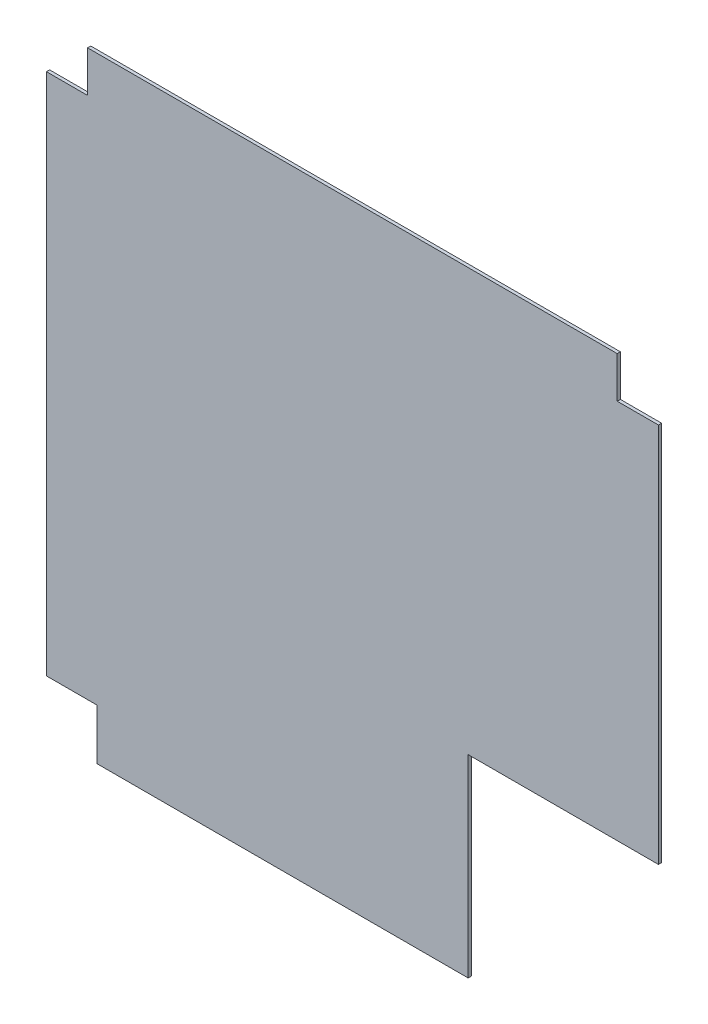
ISO-10303-21;
HEADER;
FILE_DESCRIPTION(('STEP AP214'),'2;1');
FILE_NAME('part.step','',(''),(''),'','','');
FILE_SCHEMA(('AUTOMOTIVE_DESIGN { 1 0 10303 214 1 1 1 1 }'));
ENDSEC;
DATA;
#1=APPLICATION_CONTEXT('core data for automotive mechanical design processes');
#2=APPLICATION_PROTOCOL_DEFINITION('international standard','automotive_design',2000,#1);
#3=PRODUCT_CONTEXT('',#1,'mechanical');
#4=PRODUCT('Part','Part','',(#3));
#5=PRODUCT_RELATED_PRODUCT_CATEGORY('part','',(#4));
#6=PRODUCT_DEFINITION_FORMATION('','',#4);
#7=PRODUCT_DEFINITION_CONTEXT('part definition',#1,'design');
#8=PRODUCT_DEFINITION('design','',#6,#7);
#9=PRODUCT_DEFINITION_SHAPE('','',#8);
#10=(LENGTH_UNIT() NAMED_UNIT(*) SI_UNIT(.MILLI.,.METRE.));
#11=(NAMED_UNIT(*) PLANE_ANGLE_UNIT() SI_UNIT($,.RADIAN.));
#12=(NAMED_UNIT(*) SI_UNIT($,.STERADIAN.) SOLID_ANGLE_UNIT());
#13=UNCERTAINTY_MEASURE_WITH_UNIT(LENGTH_MEASURE(1.E-05),#10,'distance_accuracy_value','');
#14=(GEOMETRIC_REPRESENTATION_CONTEXT(3) GLOBAL_UNCERTAINTY_ASSIGNED_CONTEXT((#13)) GLOBAL_UNIT_ASSIGNED_CONTEXT((#10,
#11,#12)) REPRESENTATION_CONTEXT('',''));
#15=CARTESIAN_POINT('',(0.,0.,0.));
#16=DIRECTION('',(0.,0.,1.));
#17=DIRECTION('',(1.,0.,0.));
#18=AXIS2_PLACEMENT_3D('',#15,#16,#17);
#19=CARTESIAN_POINT('',(-371.475,307.975,3.175));
#20=DIRECTION('',(0.,-1.,0.));
#21=DIRECTION('',(0.,0.,-1.));
#22=AXIS2_PLACEMENT_3D('',#19,#20,#21);
#23=PLANE('',#22);
#24=DIRECTION('',(-1.,0.,0.));
#25=VECTOR('',#24,1.);
#26=CARTESIAN_POINT('',(-371.475,307.975,3.175));
#27=LINE('',#26,#25);
#28=CARTESIAN_POINT('',(200.025,307.975,3.175));
#29=VERTEX_POINT('',#28);
#30=CARTESIAN_POINT('',(-330.2,307.975,3.175));
#31=VERTEX_POINT('',#30);
#32=EDGE_CURVE('E182',#29,#31,#27,.T.);
#33=ORIENTED_EDGE('',*,*,#32,.F.);
#34=DIRECTION('',(0.,0.,1.));
#35=VECTOR('',#34,1.);
#36=CARTESIAN_POINT('',(200.025,307.975,0.));
#37=LINE('',#36,#35);
#38=CARTESIAN_POINT('',(200.025,307.975,0.));
#39=VERTEX_POINT('',#38);
#40=EDGE_CURVE('E137',#39,#29,#37,.T.);
#41=ORIENTED_EDGE('',*,*,#40,.F.);
#42=DIRECTION('',(-1.,0.,0.));
#43=VECTOR('',#42,1.);
#44=CARTESIAN_POINT('',(-371.475,307.975,0.));
#45=LINE('',#44,#43);
#46=CARTESIAN_POINT('',(-330.2,307.975,0.));
#47=VERTEX_POINT('',#46);
#48=EDGE_CURVE('E178',#39,#47,#45,.T.);
#49=ORIENTED_EDGE('',*,*,#48,.T.);
#50=DIRECTION('',(0.,0.,1.));
#51=VECTOR('',#50,1.);
#52=CARTESIAN_POINT('',(-330.2,307.975,0.));
#53=LINE('',#52,#51);
#54=EDGE_CURVE('E175',#47,#31,#53,.T.);
#55=ORIENTED_EDGE('',*,*,#54,.T.);
#56=EDGE_LOOP('',(#33,#41,#49,#55));
#57=FACE_BOUND('',#56,.T.);
#58=ADVANCED_FACE('F40',(#57),#23,.F.);
#59=CARTESIAN_POINT('',(-371.475,-307.975,3.175));
#60=DIRECTION('',(0.,1.,0.));
#61=DIRECTION('',(0.,0.,1.));
#62=AXIS2_PLACEMENT_3D('',#59,#60,#61);
#63=PLANE('',#62);
#64=DIRECTION('',(1.,0.,0.));
#65=VECTOR('',#64,1.);
#66=CARTESIAN_POINT('',(-371.475,-307.975,3.175));
#67=LINE('',#66,#65);
#68=CARTESIAN_POINT('',(-320.675,-307.975,3.175));
#69=VERTEX_POINT('',#68);
#70=CARTESIAN_POINT('',(50.8000000000001,-307.975,3.175));
#71=VERTEX_POINT('',#70);
#72=EDGE_CURVE('E11',#69,#71,#67,.T.);
#73=ORIENTED_EDGE('',*,*,#72,.F.);
#74=DIRECTION('',(0.,0.,1.));
#75=VECTOR('',#74,1.);
#76=CARTESIAN_POINT('',(-320.675,-307.975,0.));
#77=LINE('',#76,#75);
#78=CARTESIAN_POINT('',(-320.675,-307.975,0.));
#79=VERTEX_POINT('',#78);
#80=EDGE_CURVE('E202',#79,#69,#77,.T.);
#81=ORIENTED_EDGE('',*,*,#80,.F.);
#82=DIRECTION('',(1.,0.,0.));
#83=VECTOR('',#82,1.);
#84=CARTESIAN_POINT('',(-371.475,-307.975,0.));
#85=LINE('',#84,#83);
#86=CARTESIAN_POINT('',(50.8000000000001,-307.975,0.));
#87=VERTEX_POINT('',#86);
#88=EDGE_CURVE('E43',#79,#87,#85,.T.);
#89=ORIENTED_EDGE('',*,*,#88,.T.);
#90=DIRECTION('',(0.,0.,1.));
#91=VECTOR('',#90,1.);
#92=CARTESIAN_POINT('',(50.8000000000001,-307.975,0.));
#93=LINE('',#92,#91);
#94=EDGE_CURVE('E201',#87,#71,#93,.T.);
#95=ORIENTED_EDGE('',*,*,#94,.T.);
#96=EDGE_LOOP('',(#73,#81,#89,#95));
#97=FACE_BOUND('',#96,.T.);
#98=ADVANCED_FACE('F200',(#97),#63,.F.);
#99=CARTESIAN_POINT('',(-371.475,-307.975,3.175));
#100=DIRECTION('',(1.,0.,0.));
#101=DIRECTION('',(0.,0.,-1.));
#102=AXIS2_PLACEMENT_3D('',#99,#100,#101);
#103=PLANE('',#102);
#104=DIRECTION('',(0.,-1.,0.));
#105=VECTOR('',#104,1.);
#106=CARTESIAN_POINT('',(-371.475,-307.975,0.));
#107=LINE('',#106,#105);
#108=CARTESIAN_POINT('',(-371.475,266.7,0.));
#109=VERTEX_POINT('',#108);
#110=CARTESIAN_POINT('',(-371.475,-257.175,0.));
#111=VERTEX_POINT('',#110);
#112=EDGE_CURVE('E188',#109,#111,#107,.T.);
#113=ORIENTED_EDGE('',*,*,#112,.T.);
#114=DIRECTION('',(0.,0.,1.));
#115=VECTOR('',#114,1.);
#116=CARTESIAN_POINT('',(-371.475,-257.175,0.));
#117=LINE('',#116,#115);
#118=CARTESIAN_POINT('',(-371.475,-257.175,3.175));
#119=VERTEX_POINT('',#118);
#120=EDGE_CURVE('E154',#111,#119,#117,.T.);
#121=ORIENTED_EDGE('',*,*,#120,.T.);
#122=DIRECTION('',(0.,-1.,0.));
#123=VECTOR('',#122,1.);
#124=CARTESIAN_POINT('',(-371.475,-307.975,3.175));
#125=LINE('',#124,#123);
#126=CARTESIAN_POINT('',(-371.475,266.7,3.175));
#127=VERTEX_POINT('',#126);
#128=EDGE_CURVE('E48',#127,#119,#125,.T.);
#129=ORIENTED_EDGE('',*,*,#128,.F.);
#130=DIRECTION('',(0.,0.,1.));
#131=VECTOR('',#130,1.);
#132=CARTESIAN_POINT('',(-371.475,266.7,0.));
#133=LINE('',#132,#131);
#134=EDGE_CURVE('E169',#109,#127,#133,.T.);
#135=ORIENTED_EDGE('',*,*,#134,.F.);
#136=EDGE_LOOP('',(#113,#121,#129,#135));
#137=FACE_BOUND('',#136,.T.);
#138=ADVANCED_FACE('F236',(#137),#103,.F.);
#139=CARTESIAN_POINT('',(0.,0.,3.175));
#140=DIRECTION('',(0.,0.,-1.));
#141=DIRECTION('',(-1.,0.,0.));
#142=AXIS2_PLACEMENT_3D('',#139,#140,#141);
#143=PLANE('',#142);
#144=DIRECTION('',(-1.,0.,0.));
#145=VECTOR('',#144,1.);
#146=CARTESIAN_POINT('',(50.8000000000001,-114.3,3.175));
#147=LINE('',#146,#145);
#148=CARTESIAN_POINT('',(241.3,-114.3,3.175));
#149=VERTEX_POINT('',#148);
#150=CARTESIAN_POINT('',(50.8000000000001,-114.3,3.175));
#151=VERTEX_POINT('',#150);
#152=EDGE_CURVE('E147',#149,#151,#147,.T.);
#153=ORIENTED_EDGE('',*,*,#152,.F.);
#154=DIRECTION('',(0.,-1.,0.));
#155=VECTOR('',#154,1.);
#156=CARTESIAN_POINT('',(241.3,307.975,3.175));
#157=LINE('',#156,#155);
#158=CARTESIAN_POINT('',(241.3,266.7,3.175));
#159=VERTEX_POINT('',#158);
#160=EDGE_CURVE('E130',#159,#149,#157,.T.);
#161=ORIENTED_EDGE('',*,*,#160,.F.);
#162=DIRECTION('',(1.,0.,0.));
#163=VECTOR('',#162,1.);
#164=CARTESIAN_POINT('',(200.025,266.7,3.175));
#165=LINE('',#164,#163);
#166=CARTESIAN_POINT('',(200.025,266.7,3.175));
#167=VERTEX_POINT('',#166);
#168=EDGE_CURVE('E144',#167,#159,#165,.T.);
#169=ORIENTED_EDGE('',*,*,#168,.F.);
#170=DIRECTION('',(0.,-1.,0.));
#171=VECTOR('',#170,1.);
#172=CARTESIAN_POINT('',(200.025,307.975,3.175));
#173=LINE('',#172,#171);
#174=EDGE_CURVE('E151',#29,#167,#173,.T.);
#175=ORIENTED_EDGE('',*,*,#174,.F.);
#176=ORIENTED_EDGE('',*,*,#32,.T.);
#177=DIRECTION('',(0.,1.,0.));
#178=VECTOR('',#177,1.);
#179=CARTESIAN_POINT('',(-330.2,307.975,3.175));
#180=LINE('',#179,#178);
#181=CARTESIAN_POINT('',(-330.2,266.7,3.175));
#182=VERTEX_POINT('',#181);
#183=EDGE_CURVE('E166',#182,#31,#180,.T.);
#184=ORIENTED_EDGE('',*,*,#183,.F.);
#185=DIRECTION('',(1.,0.,0.));
#186=VECTOR('',#185,1.);
#187=CARTESIAN_POINT('',(-371.475,266.7,3.175));
#188=LINE('',#187,#186);
#189=EDGE_CURVE('E170',#127,#182,#188,.T.);
#190=ORIENTED_EDGE('',*,*,#189,.F.);
#191=ORIENTED_EDGE('',*,*,#128,.T.);
#192=DIRECTION('',(-1.,0.,0.));
#193=VECTOR('',#192,1.);
#194=CARTESIAN_POINT('',(-371.475,-257.175,3.175));
#195=LINE('',#194,#193);
#196=CARTESIAN_POINT('',(-320.675,-257.175,3.175));
#197=VERTEX_POINT('',#196);
#198=EDGE_CURVE('E224',#197,#119,#195,.T.);
#199=ORIENTED_EDGE('',*,*,#198,.F.);
#200=DIRECTION('',(0.,1.,0.));
#201=VECTOR('',#200,1.);
#202=CARTESIAN_POINT('',(-320.675,-307.975,3.175));
#203=LINE('',#202,#201);
#204=EDGE_CURVE('E173',#69,#197,#203,.T.);
#205=ORIENTED_EDGE('',*,*,#204,.F.);
#206=ORIENTED_EDGE('',*,*,#72,.T.);
#207=DIRECTION('',(0.,-1.,0.));
#208=VECTOR('',#207,1.);
#209=CARTESIAN_POINT('',(50.8000000000001,-307.975,3.175));
#210=LINE('',#209,#208);
#211=EDGE_CURVE('E215',#151,#71,#210,.T.);
#212=ORIENTED_EDGE('',*,*,#211,.F.);
#213=EDGE_LOOP('',(#153,#161,#169,#175,#176,#184,#190,#191,#199,#205,#206,#212));
#214=FACE_BOUND('',#213,.T.);
#215=ADVANCED_FACE('F142',(#214),#143,.F.);
#216=CARTESIAN_POINT('',(0.,0.,0.));
#217=DIRECTION('',(0.,0.,-1.));
#218=DIRECTION('',(-1.,0.,0.));
#219=AXIS2_PLACEMENT_3D('',#216,#217,#218);
#220=PLANE('',#219);
#221=DIRECTION('',(0.,-1.,0.));
#222=VECTOR('',#221,1.);
#223=CARTESIAN_POINT('',(241.3,307.975,0.));
#224=LINE('',#223,#222);
#225=CARTESIAN_POINT('',(241.3,266.7,0.));
#226=VERTEX_POINT('',#225);
#227=CARTESIAN_POINT('',(241.3,-114.3,0.));
#228=VERTEX_POINT('',#227);
#229=EDGE_CURVE('E64',#226,#228,#224,.T.);
#230=ORIENTED_EDGE('',*,*,#229,.T.);
#231=DIRECTION('',(-1.,0.,0.));
#232=VECTOR('',#231,1.);
#233=CARTESIAN_POINT('',(50.8000000000001,-114.3,0.));
#234=LINE('',#233,#232);
#235=CARTESIAN_POINT('',(50.8000000000001,-114.3,0.));
#236=VERTEX_POINT('',#235);
#237=EDGE_CURVE('E212',#228,#236,#234,.T.);
#238=ORIENTED_EDGE('',*,*,#237,.T.);
#239=DIRECTION('',(0.,-1.,0.));
#240=VECTOR('',#239,1.);
#241=CARTESIAN_POINT('',(50.8000000000001,-307.975,0.));
#242=LINE('',#241,#240);
#243=EDGE_CURVE('E210',#236,#87,#242,.T.);
#244=ORIENTED_EDGE('',*,*,#243,.T.);
#245=ORIENTED_EDGE('',*,*,#88,.F.);
#246=DIRECTION('',(0.,1.,0.));
#247=VECTOR('',#246,1.);
#248=CARTESIAN_POINT('',(-320.675,-307.975,0.));
#249=LINE('',#248,#247);
#250=CARTESIAN_POINT('',(-320.675,-257.175,0.));
#251=VERTEX_POINT('',#250);
#252=EDGE_CURVE('E207',#79,#251,#249,.T.);
#253=ORIENTED_EDGE('',*,*,#252,.T.);
#254=DIRECTION('',(-1.,0.,0.));
#255=VECTOR('',#254,1.);
#256=CARTESIAN_POINT('',(-371.475,-257.175,0.));
#257=LINE('',#256,#255);
#258=EDGE_CURVE('E56',#251,#111,#257,.T.);
#259=ORIENTED_EDGE('',*,*,#258,.T.);
#260=ORIENTED_EDGE('',*,*,#112,.F.);
#261=DIRECTION('',(1.,0.,0.));
#262=VECTOR('',#261,1.);
#263=CARTESIAN_POINT('',(-371.475,266.7,0.));
#264=LINE('',#263,#262);
#265=CARTESIAN_POINT('',(-330.2,266.7,0.));
#266=VERTEX_POINT('',#265);
#267=EDGE_CURVE('E162',#109,#266,#264,.T.);
#268=ORIENTED_EDGE('',*,*,#267,.T.);
#269=DIRECTION('',(0.,1.,0.));
#270=VECTOR('',#269,1.);
#271=CARTESIAN_POINT('',(-330.2,307.975,0.));
#272=LINE('',#271,#270);
#273=EDGE_CURVE('E165',#266,#47,#272,.T.);
#274=ORIENTED_EDGE('',*,*,#273,.T.);
#275=ORIENTED_EDGE('',*,*,#48,.F.);
#276=DIRECTION('',(0.,-1.,0.));
#277=VECTOR('',#276,1.);
#278=CARTESIAN_POINT('',(200.025,307.975,0.));
#279=LINE('',#278,#277);
#280=CARTESIAN_POINT('',(200.025,266.7,0.));
#281=VERTEX_POINT('',#280);
#282=EDGE_CURVE('E152',#39,#281,#279,.T.);
#283=ORIENTED_EDGE('',*,*,#282,.T.);
#284=DIRECTION('',(1.,0.,0.));
#285=VECTOR('',#284,1.);
#286=CARTESIAN_POINT('',(200.025,266.7,0.));
#287=LINE('',#286,#285);
#288=EDGE_CURVE('E157',#281,#226,#287,.T.);
#289=ORIENTED_EDGE('',*,*,#288,.T.);
#290=EDGE_LOOP('',(#230,#238,#244,#245,#253,#259,#260,#268,#274,#275,#283,#289));
#291=FACE_BOUND('',#290,.T.);
#292=ADVANCED_FACE('F206',(#291),#220,.T.);
#293=CARTESIAN_POINT('',(-330.2,307.975,0.));
#294=DIRECTION('',(1.,0.,0.));
#295=DIRECTION('',(0.,0.,-1.));
#296=AXIS2_PLACEMENT_3D('',#293,#294,#295);
#297=PLANE('',#296);
#298=ORIENTED_EDGE('',*,*,#183,.T.);
#299=ORIENTED_EDGE('',*,*,#54,.F.);
#300=ORIENTED_EDGE('',*,*,#273,.F.);
#301=DIRECTION('',(0.,0.,1.));
#302=VECTOR('',#301,1.);
#303=CARTESIAN_POINT('',(-330.2,266.7,0.));
#304=LINE('',#303,#302);
#305=EDGE_CURVE('E179',#266,#182,#304,.T.);
#306=ORIENTED_EDGE('',*,*,#305,.T.);
#307=EDGE_LOOP('',(#298,#299,#300,#306));
#308=FACE_BOUND('',#307,.T.);
#309=ADVANCED_FACE('F242',(#308),#297,.F.);
#310=CARTESIAN_POINT('',(-371.475,266.7,0.));
#311=DIRECTION('',(0.,-1.,0.));
#312=DIRECTION('',(0.,0.,-1.));
#313=AXIS2_PLACEMENT_3D('',#310,#311,#312);
#314=PLANE('',#313);
#315=ORIENTED_EDGE('',*,*,#189,.T.);
#316=ORIENTED_EDGE('',*,*,#305,.F.);
#317=ORIENTED_EDGE('',*,*,#267,.F.);
#318=ORIENTED_EDGE('',*,*,#134,.T.);
#319=EDGE_LOOP('',(#315,#316,#317,#318));
#320=FACE_BOUND('',#319,.T.);
#321=ADVANCED_FACE('F233',(#320),#314,.F.);
#322=CARTESIAN_POINT('',(50.8000000000001,-307.975,0.));
#323=DIRECTION('',(-1.,0.,0.));
#324=DIRECTION('',(0.,-1.,0.));
#325=AXIS2_PLACEMENT_3D('',#322,#323,#324);
#326=PLANE('',#325);
#327=ORIENTED_EDGE('',*,*,#211,.T.);
#328=ORIENTED_EDGE('',*,*,#94,.F.);
#329=ORIENTED_EDGE('',*,*,#243,.F.);
#330=DIRECTION('',(0.,0.,1.));
#331=VECTOR('',#330,1.);
#332=CARTESIAN_POINT('',(50.8000000000001,-114.3,0.));
#333=LINE('',#332,#331);
#334=EDGE_CURVE('E248',#236,#151,#333,.T.);
#335=ORIENTED_EDGE('',*,*,#334,.T.);
#336=EDGE_LOOP('',(#327,#328,#329,#335));
#337=FACE_BOUND('',#336,.T.);
#338=ADVANCED_FACE('F255',(#337),#326,.F.);
#339=CARTESIAN_POINT('',(50.8000000000001,-114.3,0.));
#340=DIRECTION('',(0.,1.,0.));
#341=DIRECTION('',(0.,0.,1.));
#342=AXIS2_PLACEMENT_3D('',#339,#340,#341);
#343=PLANE('',#342);
#344=ORIENTED_EDGE('',*,*,#152,.T.);
#345=ORIENTED_EDGE('',*,*,#334,.F.);
#346=ORIENTED_EDGE('',*,*,#237,.F.);
#347=DIRECTION('',(0.,0.,1.));
#348=VECTOR('',#347,1.);
#349=CARTESIAN_POINT('',(241.3,-114.3,0.));
#350=LINE('',#349,#348);
#351=EDGE_CURVE('E250',#228,#149,#350,.T.);
#352=ORIENTED_EDGE('',*,*,#351,.T.);
#353=EDGE_LOOP('',(#344,#345,#346,#352));
#354=FACE_BOUND('',#353,.T.);
#355=ADVANCED_FACE('F254',(#354),#343,.F.);
#356=CARTESIAN_POINT('',(200.025,307.975,0.));
#357=DIRECTION('',(-1.,0.,0.));
#358=DIRECTION('',(0.,0.,1.));
#359=AXIS2_PLACEMENT_3D('',#356,#357,#358);
#360=PLANE('',#359);
#361=ORIENTED_EDGE('',*,*,#174,.T.);
#362=DIRECTION('',(0.,0.,1.));
#363=VECTOR('',#362,1.);
#364=CARTESIAN_POINT('',(200.025,266.7,0.));
#365=LINE('',#364,#363);
#366=EDGE_CURVE('E136',#281,#167,#365,.T.);
#367=ORIENTED_EDGE('',*,*,#366,.F.);
#368=ORIENTED_EDGE('',*,*,#282,.F.);
#369=ORIENTED_EDGE('',*,*,#40,.T.);
#370=EDGE_LOOP('',(#361,#367,#368,#369));
#371=FACE_BOUND('',#370,.T.);
#372=ADVANCED_FACE('F246',(#371),#360,.F.);
#373=CARTESIAN_POINT('',(200.025,266.7,0.));
#374=DIRECTION('',(0.,-1.,0.));
#375=DIRECTION('',(0.,0.,-1.));
#376=AXIS2_PLACEMENT_3D('',#373,#374,#375);
#377=PLANE('',#376);
#378=ORIENTED_EDGE('',*,*,#168,.T.);
#379=DIRECTION('',(0.,0.,1.));
#380=VECTOR('',#379,1.);
#381=CARTESIAN_POINT('',(241.3,266.7,0.));
#382=LINE('',#381,#380);
#383=EDGE_CURVE('E127',#226,#159,#382,.T.);
#384=ORIENTED_EDGE('',*,*,#383,.F.);
#385=ORIENTED_EDGE('',*,*,#288,.F.);
#386=ORIENTED_EDGE('',*,*,#366,.T.);
#387=EDGE_LOOP('',(#378,#384,#385,#386));
#388=FACE_BOUND('',#387,.T.);
#389=ADVANCED_FACE('F149',(#388),#377,.F.);
#390=CARTESIAN_POINT('',(-371.475,-257.175,0.));
#391=DIRECTION('',(0.,1.,0.));
#392=DIRECTION('',(0.,0.,1.));
#393=AXIS2_PLACEMENT_3D('',#390,#391,#392);
#394=PLANE('',#393);
#395=ORIENTED_EDGE('',*,*,#198,.T.);
#396=ORIENTED_EDGE('',*,*,#120,.F.);
#397=ORIENTED_EDGE('',*,*,#258,.F.);
#398=DIRECTION('',(0.,0.,1.));
#399=VECTOR('',#398,1.);
#400=CARTESIAN_POINT('',(-320.675,-257.175,0.));
#401=LINE('',#400,#399);
#402=EDGE_CURVE('E221',#251,#197,#401,.T.);
#403=ORIENTED_EDGE('',*,*,#402,.T.);
#404=EDGE_LOOP('',(#395,#396,#397,#403));
#405=FACE_BOUND('',#404,.T.);
#406=ADVANCED_FACE('F283',(#405),#394,.F.);
#407=CARTESIAN_POINT('',(-320.675,-307.975,0.));
#408=DIRECTION('',(1.,0.,0.));
#409=DIRECTION('',(0.,1.,0.));
#410=AXIS2_PLACEMENT_3D('',#407,#408,#409);
#411=PLANE('',#410);
#412=ORIENTED_EDGE('',*,*,#204,.T.);
#413=ORIENTED_EDGE('',*,*,#402,.F.);
#414=ORIENTED_EDGE('',*,*,#252,.F.);
#415=ORIENTED_EDGE('',*,*,#80,.T.);
#416=EDGE_LOOP('',(#412,#413,#414,#415));
#417=FACE_BOUND('',#416,.T.);
#418=ADVANCED_FACE('F287',(#417),#411,.F.);
#419=CARTESIAN_POINT('',(241.3,307.975,0.));
#420=DIRECTION('',(-1.,0.,0.));
#421=DIRECTION('',(0.,0.,1.));
#422=AXIS2_PLACEMENT_3D('',#419,#420,#421);
#423=PLANE('',#422);
#424=ORIENTED_EDGE('',*,*,#229,.F.);
#425=ORIENTED_EDGE('',*,*,#383,.T.);
#426=ORIENTED_EDGE('',*,*,#160,.T.);
#427=ORIENTED_EDGE('',*,*,#351,.F.);
#428=EDGE_LOOP('',(#424,#425,#426,#427));
#429=FACE_BOUND('',#428,.T.);
#430=ADVANCED_FACE('F129',(#429),#423,.F.);
#431=CLOSED_SHELL('',(#58,#98,#138,#215,#292,#309,#321,#338,#355,#372,#389,#406,#418,#430));
#432=MANIFOLD_SOLID_BREP('B2',#431);
#433=ADVANCED_BREP_SHAPE_REPRESENTATION('',(#18,#432),#14);
#434=SHAPE_DEFINITION_REPRESENTATION(#9,#433);
ENDSEC;
END-ISO-10303-21;
